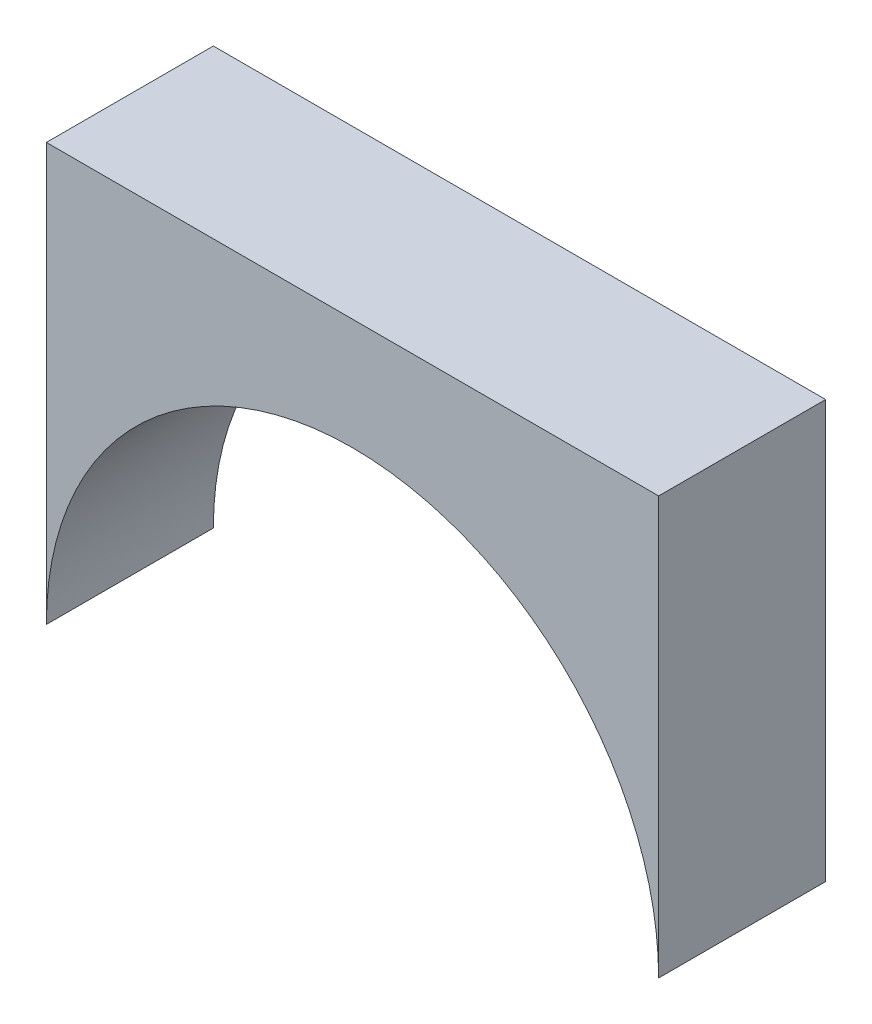
ISO-10303-21;
HEADER;
FILE_DESCRIPTION(('STEP AP214'),'2;1');
FILE_NAME('part.step','',(''),(''),'','','');
FILE_SCHEMA(('AUTOMOTIVE_DESIGN { 1 0 10303 214 1 1 1 1 }'));
ENDSEC;
DATA;
#1=APPLICATION_CONTEXT('core data for automotive mechanical design processes');
#2=APPLICATION_PROTOCOL_DEFINITION('international standard','automotive_design',2000,#1);
#3=PRODUCT_CONTEXT('',#1,'mechanical');
#4=PRODUCT('Part','Part','',(#3));
#5=PRODUCT_RELATED_PRODUCT_CATEGORY('part','',(#4));
#6=PRODUCT_DEFINITION_FORMATION('','',#4);
#7=PRODUCT_DEFINITION_CONTEXT('part definition',#1,'design');
#8=PRODUCT_DEFINITION('design','',#6,#7);
#9=PRODUCT_DEFINITION_SHAPE('','',#8);
#10=(LENGTH_UNIT() NAMED_UNIT(*) SI_UNIT(.MILLI.,.METRE.));
#11=(NAMED_UNIT(*) PLANE_ANGLE_UNIT() SI_UNIT($,.RADIAN.));
#12=(NAMED_UNIT(*) SI_UNIT($,.STERADIAN.) SOLID_ANGLE_UNIT());
#13=UNCERTAINTY_MEASURE_WITH_UNIT(LENGTH_MEASURE(1.E-05),#10,'distance_accuracy_value','');
#14=(GEOMETRIC_REPRESENTATION_CONTEXT(3) GLOBAL_UNCERTAINTY_ASSIGNED_CONTEXT((#13)) GLOBAL_UNIT_ASSIGNED_CONTEXT((#10,
#11,#12)) REPRESENTATION_CONTEXT('',''));
#15=CARTESIAN_POINT('',(0.,0.,0.));
#16=DIRECTION('',(0.,0.,1.));
#17=DIRECTION('',(1.,0.,0.));
#18=AXIS2_PLACEMENT_3D('',#15,#16,#17);
#19=CARTESIAN_POINT('',(0.,0.,3.));
#20=DIRECTION('',(0.,0.,-1.));
#21=DIRECTION('',(-1.,0.,0.));
#22=AXIS2_PLACEMENT_3D('',#19,#20,#21);
#23=CYLINDRICAL_SURFACE('',#22,5.5);
#24=CARTESIAN_POINT('',(0.,0.,0.));
#25=DIRECTION('',(0.,0.,-1.));
#26=DIRECTION('',(1.,0.,0.));
#27=AXIS2_PLACEMENT_3D('',#24,#25,#26);
#28=CIRCLE('',#27,5.5);
#29=CARTESIAN_POINT('',(-5.5,0.,0.));
#30=VERTEX_POINT('',#29);
#31=CARTESIAN_POINT('',(5.5,0.,0.));
#32=VERTEX_POINT('',#31);
#33=EDGE_CURVE('E104',#30,#32,#28,.T.);
#34=ORIENTED_EDGE('',*,*,#33,.T.);
#35=DIRECTION('',(0.,0.,-1.));
#36=VECTOR('',#35,1.);
#37=CARTESIAN_POINT('',(5.5,0.,3.));
#38=LINE('',#37,#36);
#39=CARTESIAN_POINT('',(5.5,0.,3.));
#40=VERTEX_POINT('',#39);
#41=EDGE_CURVE('E11',#40,#32,#38,.T.);
#42=ORIENTED_EDGE('',*,*,#41,.F.);
#43=CARTESIAN_POINT('',(0.,0.,3.));
#44=DIRECTION('',(0.,0.,-1.));
#45=DIRECTION('',(1.,0.,0.));
#46=AXIS2_PLACEMENT_3D('',#43,#44,#45);
#47=CIRCLE('',#46,5.5);
#48=CARTESIAN_POINT('',(-5.5,0.,3.));
#49=VERTEX_POINT('',#48);
#50=EDGE_CURVE('E92',#49,#40,#47,.T.);
#51=ORIENTED_EDGE('',*,*,#50,.F.);
#52=DIRECTION('',(0.,0.,-1.));
#53=VECTOR('',#52,1.);
#54=CARTESIAN_POINT('',(-5.5,0.,3.));
#55=LINE('',#54,#53);
#56=EDGE_CURVE('E100',#49,#30,#55,.T.);
#57=ORIENTED_EDGE('',*,*,#56,.T.);
#58=EDGE_LOOP('',(#34,#42,#51,#57));
#59=FACE_BOUND('',#58,.T.);
#60=ADVANCED_FACE('F41',(#59),#23,.F.);
#61=CARTESIAN_POINT('',(5.5,7.5,3.));
#62=DIRECTION('',(-1.,0.,0.));
#63=DIRECTION('',(0.,0.,1.));
#64=AXIS2_PLACEMENT_3D('',#61,#62,#63);
#65=PLANE('',#64);
#66=DIRECTION('',(0.,1.,0.));
#67=VECTOR('',#66,1.);
#68=CARTESIAN_POINT('',(5.5,7.5,0.));
#69=LINE('',#68,#67);
#70=CARTESIAN_POINT('',(5.5,7.5,0.));
#71=VERTEX_POINT('',#70);
#72=EDGE_CURVE('E96',#32,#71,#69,.T.);
#73=ORIENTED_EDGE('',*,*,#72,.T.);
#74=DIRECTION('',(0.,0.,-1.));
#75=VECTOR('',#74,1.);
#76=CARTESIAN_POINT('',(5.5,7.5,3.));
#77=LINE('',#76,#75);
#78=CARTESIAN_POINT('',(5.5,7.5,3.));
#79=VERTEX_POINT('',#78);
#80=EDGE_CURVE('E49',#79,#71,#77,.T.);
#81=ORIENTED_EDGE('',*,*,#80,.F.);
#82=DIRECTION('',(0.,1.,0.));
#83=VECTOR('',#82,1.);
#84=CARTESIAN_POINT('',(5.5,7.5,3.));
#85=LINE('',#84,#83);
#86=EDGE_CURVE('E87',#40,#79,#85,.T.);
#87=ORIENTED_EDGE('',*,*,#86,.F.);
#88=ORIENTED_EDGE('',*,*,#41,.T.);
#89=EDGE_LOOP('',(#73,#81,#87,#88));
#90=FACE_BOUND('',#89,.T.);
#91=ADVANCED_FACE('F95',(#90),#65,.F.);
#92=CARTESIAN_POINT('',(-5.5,7.5,3.));
#93=DIRECTION('',(0.,-1.,0.));
#94=DIRECTION('',(0.,0.,-1.));
#95=AXIS2_PLACEMENT_3D('',#92,#93,#94);
#96=PLANE('',#95);
#97=DIRECTION('',(-1.,0.,0.));
#98=VECTOR('',#97,1.);
#99=CARTESIAN_POINT('',(-5.5,7.5,0.));
#100=LINE('',#99,#98);
#101=CARTESIAN_POINT('',(-5.5,7.5,0.));
#102=VERTEX_POINT('',#101);
#103=EDGE_CURVE('E74',#71,#102,#100,.T.);
#104=ORIENTED_EDGE('',*,*,#103,.T.);
#105=DIRECTION('',(0.,0.,-1.));
#106=VECTOR('',#105,1.);
#107=CARTESIAN_POINT('',(-5.5,7.5,3.));
#108=LINE('',#107,#106);
#109=CARTESIAN_POINT('',(-5.5,7.5,3.));
#110=VERTEX_POINT('',#109);
#111=EDGE_CURVE('E97',#110,#102,#108,.T.);
#112=ORIENTED_EDGE('',*,*,#111,.F.);
#113=DIRECTION('',(-1.,0.,0.));
#114=VECTOR('',#113,1.);
#115=CARTESIAN_POINT('',(-5.5,7.5,3.));
#116=LINE('',#115,#114);
#117=EDGE_CURVE('E90',#79,#110,#116,.T.);
#118=ORIENTED_EDGE('',*,*,#117,.F.);
#119=ORIENTED_EDGE('',*,*,#80,.T.);
#120=EDGE_LOOP('',(#104,#112,#118,#119));
#121=FACE_BOUND('',#120,.T.);
#122=ADVANCED_FACE('F98',(#121),#96,.F.);
#123=CARTESIAN_POINT('',(-5.5,0.,3.));
#124=DIRECTION('',(1.,0.,0.));
#125=DIRECTION('',(0.,0.,-1.));
#126=AXIS2_PLACEMENT_3D('',#123,#124,#125);
#127=PLANE('',#126);
#128=DIRECTION('',(0.,-1.,0.));
#129=VECTOR('',#128,1.);
#130=CARTESIAN_POINT('',(-5.5,0.,0.));
#131=LINE('',#130,#129);
#132=EDGE_CURVE('E80',#102,#30,#131,.T.);
#133=ORIENTED_EDGE('',*,*,#132,.T.);
#134=ORIENTED_EDGE('',*,*,#56,.F.);
#135=DIRECTION('',(0.,-1.,0.));
#136=VECTOR('',#135,1.);
#137=CARTESIAN_POINT('',(-5.5,0.,3.));
#138=LINE('',#137,#136);
#139=EDGE_CURVE('E57',#110,#49,#138,.T.);
#140=ORIENTED_EDGE('',*,*,#139,.F.);
#141=ORIENTED_EDGE('',*,*,#111,.T.);
#142=EDGE_LOOP('',(#133,#134,#140,#141));
#143=FACE_BOUND('',#142,.T.);
#144=ADVANCED_FACE('F111',(#143),#127,.F.);
#145=CARTESIAN_POINT('',(0.,0.,3.));
#146=DIRECTION('',(0.,0.,1.));
#147=DIRECTION('',(1.,0.,0.));
#148=AXIS2_PLACEMENT_3D('',#145,#146,#147);
#149=PLANE('',#148);
#150=ORIENTED_EDGE('',*,*,#50,.T.);
#151=ORIENTED_EDGE('',*,*,#86,.T.);
#152=ORIENTED_EDGE('',*,*,#117,.T.);
#153=ORIENTED_EDGE('',*,*,#139,.T.);
#154=EDGE_LOOP('',(#150,#151,#152,#153));
#155=FACE_BOUND('',#154,.T.);
#156=ADVANCED_FACE('F88',(#155),#149,.T.);
#157=CARTESIAN_POINT('',(0.,0.,0.));
#158=DIRECTION('',(0.,0.,1.));
#159=DIRECTION('',(1.,0.,0.));
#160=AXIS2_PLACEMENT_3D('',#157,#158,#159);
#161=PLANE('',#160);
#162=ORIENTED_EDGE('',*,*,#33,.F.);
#163=ORIENTED_EDGE('',*,*,#132,.F.);
#164=ORIENTED_EDGE('',*,*,#103,.F.);
#165=ORIENTED_EDGE('',*,*,#72,.F.);
#166=EDGE_LOOP('',(#162,#163,#164,#165));
#167=FACE_BOUND('',#166,.T.);
#168=ADVANCED_FACE('F114',(#167),#161,.F.);
#169=CLOSED_SHELL('',(#60,#91,#122,#144,#156,#168));
#170=MANIFOLD_SOLID_BREP('B2',#169);
#171=ADVANCED_BREP_SHAPE_REPRESENTATION('',(#18,#170),#14);
#172=SHAPE_DEFINITION_REPRESENTATION(#9,#171);
ENDSEC;
END-ISO-10303-21;
